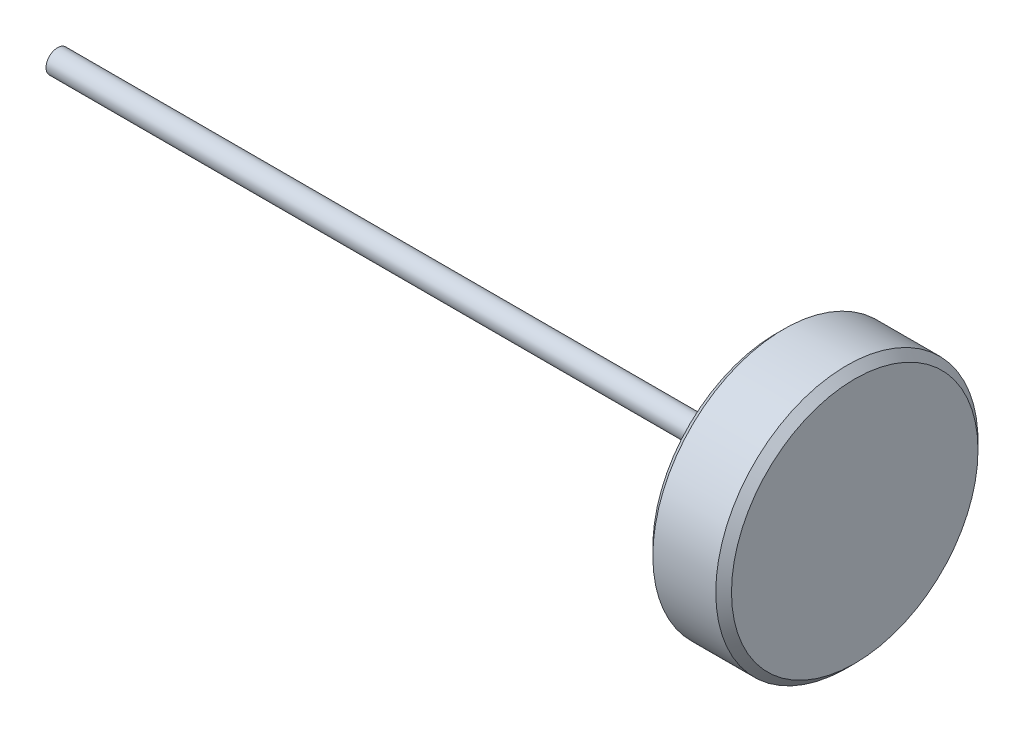
ISO-10303-21;
HEADER;
FILE_DESCRIPTION(('STEP AP214'),'2;1');
FILE_NAME('part.step','',(''),(''),'','','');
FILE_SCHEMA(('AUTOMOTIVE_DESIGN { 1 0 10303 214 1 1 1 1 }'));
ENDSEC;
DATA;
#1=APPLICATION_CONTEXT('core data for automotive mechanical design processes');
#2=APPLICATION_PROTOCOL_DEFINITION('international standard','automotive_design',2000,#1);
#3=PRODUCT_CONTEXT('',#1,'mechanical');
#4=PRODUCT('Part','Part','',(#3));
#5=PRODUCT_RELATED_PRODUCT_CATEGORY('part','',(#4));
#6=PRODUCT_DEFINITION_FORMATION('','',#4);
#7=PRODUCT_DEFINITION_CONTEXT('part definition',#1,'design');
#8=PRODUCT_DEFINITION('design','',#6,#7);
#9=PRODUCT_DEFINITION_SHAPE('','',#8);
#10=(LENGTH_UNIT() NAMED_UNIT(*) SI_UNIT(.MILLI.,.METRE.));
#11=(NAMED_UNIT(*) PLANE_ANGLE_UNIT() SI_UNIT($,.RADIAN.));
#12=(NAMED_UNIT(*) SI_UNIT($,.STERADIAN.) SOLID_ANGLE_UNIT());
#13=UNCERTAINTY_MEASURE_WITH_UNIT(LENGTH_MEASURE(1.E-05),#10,'distance_accuracy_value','');
#14=(GEOMETRIC_REPRESENTATION_CONTEXT(3) GLOBAL_UNCERTAINTY_ASSIGNED_CONTEXT((#13)) GLOBAL_UNIT_ASSIGNED_CONTEXT((#10,
#11,#12)) REPRESENTATION_CONTEXT('',''));
#15=CARTESIAN_POINT('',(0.,0.,0.));
#16=DIRECTION('',(0.,0.,1.));
#17=DIRECTION('',(1.,0.,0.));
#18=AXIS2_PLACEMENT_3D('',#15,#16,#17);
#19=CARTESIAN_POINT('',(19.05,0.,0.));
#20=DIRECTION('',(-1.,0.,0.));
#21=DIRECTION('',(0.,0.,1.));
#22=AXIS2_PLACEMENT_3D('',#19,#20,#21);
#23=CYLINDRICAL_SURFACE('',#22,31.75);
#24=CARTESIAN_POINT('',(17.1450000000001,0.,0.));
#25=DIRECTION('',(1.,0.,0.));
#26=DIRECTION('',(0.,0.,-1.));
#27=AXIS2_PLACEMENT_3D('',#24,#25,#26);
#28=CIRCLE('',#27,31.75);
#29=CARTESIAN_POINT('',(17.1450000000001,0.,31.75));
#30=VERTEX_POINT('',#29);
#31=EDGE_CURVE('E77',#30,#30,#28,.F.);
#32=CARTESIAN_POINT('',(1.90500000000014,0.,0.));
#33=DIRECTION('',(1.,0.,0.));
#34=DIRECTION('',(0.,0.,-1.));
#35=AXIS2_PLACEMENT_3D('',#32,#33,#34);
#36=CIRCLE('',#35,31.75);
#37=CARTESIAN_POINT('',(1.90500000000014,0.,31.75));
#38=VERTEX_POINT('',#37);
#39=EDGE_CURVE('E82',#38,#38,#36,.T.);
#40=CARTESIAN_POINT('',(17.1450000000001,0.,31.75));
#41=CARTESIAN_POINT('',(16.9862500000001,0.,31.75));
#42=CARTESIAN_POINT('',(16.8275000000001,0.,31.75));
#43=CARTESIAN_POINT('',(16.5100000000001,0.,31.75));
#44=CARTESIAN_POINT('',(16.3512500000001,0.,31.75));
#45=CARTESIAN_POINT('',(16.0337500000001,0.,31.75));
#46=CARTESIAN_POINT('',(15.8750000000001,0.,31.75));
#47=CARTESIAN_POINT('',(15.5575000000001,0.,31.75));
#48=CARTESIAN_POINT('',(15.3987500000001,0.,31.75));
#49=CARTESIAN_POINT('',(15.0812500000001,0.,31.75));
#50=CARTESIAN_POINT('',(14.9225000000001,0.,31.75));
#51=CARTESIAN_POINT('',(14.6050000000001,0.,31.75));
#52=CARTESIAN_POINT('',(14.4462500000001,0.,31.75));
#53=CARTESIAN_POINT('',(14.1287500000001,0.,31.75));
#54=CARTESIAN_POINT('',(13.9700000000001,0.,31.75));
#55=CARTESIAN_POINT('',(13.6525000000001,0.,31.75));
#56=CARTESIAN_POINT('',(13.4937500000001,0.,31.75));
#57=CARTESIAN_POINT('',(13.1762500000001,0.,31.75));
#58=CARTESIAN_POINT('',(13.0175000000001,0.,31.75));
#59=CARTESIAN_POINT('',(12.7000000000001,0.,31.75));
#60=CARTESIAN_POINT('',(12.5412500000001,0.,31.75));
#61=CARTESIAN_POINT('',(12.2237500000001,0.,31.75));
#62=CARTESIAN_POINT('',(12.0650000000001,0.,31.75));
#63=CARTESIAN_POINT('',(11.7475000000001,0.,31.75));
#64=CARTESIAN_POINT('',(11.5887500000001,0.,31.75));
#65=CARTESIAN_POINT('',(11.2712500000001,0.,31.75));
#66=CARTESIAN_POINT('',(11.1125000000001,0.,31.75));
#67=CARTESIAN_POINT('',(10.7950000000001,0.,31.75));
#68=CARTESIAN_POINT('',(10.6362500000001,0.,31.75));
#69=CARTESIAN_POINT('',(10.3187500000001,0.,31.75));
#70=CARTESIAN_POINT('',(10.1600000000001,0.,31.75));
#71=CARTESIAN_POINT('',(9.84250000000011,0.,31.75));
#72=CARTESIAN_POINT('',(9.68375000000011,0.,31.75));
#73=CARTESIAN_POINT('',(9.36625000000011,0.,31.75));
#74=CARTESIAN_POINT('',(9.20750000000011,0.,31.75));
#75=CARTESIAN_POINT('',(8.89000000000011,0.,31.75));
#76=CARTESIAN_POINT('',(8.73125000000011,0.,31.75));
#77=CARTESIAN_POINT('',(8.41375000000011,0.,31.75));
#78=CARTESIAN_POINT('',(8.25500000000011,0.,31.75));
#79=CARTESIAN_POINT('',(7.93750000000011,0.,31.75));
#80=CARTESIAN_POINT('',(7.77875000000011,0.,31.75));
#81=CARTESIAN_POINT('',(7.46125000000011,0.,31.75));
#82=CARTESIAN_POINT('',(7.30250000000012,0.,31.75));
#83=CARTESIAN_POINT('',(6.98500000000012,0.,31.75));
#84=CARTESIAN_POINT('',(6.82625000000012,0.,31.75));
#85=CARTESIAN_POINT('',(6.50875000000012,0.,31.75));
#86=CARTESIAN_POINT('',(6.35000000000012,0.,31.75));
#87=CARTESIAN_POINT('',(6.03250000000012,0.,31.75));
#88=CARTESIAN_POINT('',(5.87375000000012,0.,31.75));
#89=CARTESIAN_POINT('',(5.55625000000012,0.,31.75));
#90=CARTESIAN_POINT('',(5.39750000000012,0.,31.75));
#91=CARTESIAN_POINT('',(5.08000000000012,0.,31.75));
#92=CARTESIAN_POINT('',(4.92125000000012,0.,31.75));
#93=CARTESIAN_POINT('',(4.60375000000012,0.,31.75));
#94=CARTESIAN_POINT('',(4.44500000000012,0.,31.75));
#95=CARTESIAN_POINT('',(4.12750000000013,0.,31.75));
#96=CARTESIAN_POINT('',(3.96875000000013,0.,31.75));
#97=CARTESIAN_POINT('',(3.65125000000013,0.,31.75));
#98=CARTESIAN_POINT('',(3.49250000000013,0.,31.75));
#99=CARTESIAN_POINT('',(3.17500000000013,0.,31.75));
#100=CARTESIAN_POINT('',(3.01625000000013,0.,31.75));
#101=CARTESIAN_POINT('',(2.69875000000013,0.,31.75));
#102=CARTESIAN_POINT('',(2.54000000000013,0.,31.75));
#103=CARTESIAN_POINT('',(2.22250000000013,0.,31.75));
#104=CARTESIAN_POINT('',(2.06375000000013,0.,31.75));
#105=CARTESIAN_POINT('',(1.90500000000014,0.,31.75));
#106=B_SPLINE_CURVE_WITH_KNOTS('',3,(#40,#41,#42,#43,#44,#45,#46,#47,#48,#49,#50,#51,#52,#53,
#54,#55,#56,#57,#58,#59,#60,#61,#62,#63,#64,#65,#66,#67,#68,#69,#70,#71,#72,#73,#74,#75,#76,#77,
#78,#79,#80,#81,#82,#83,#84,#85,#86,#87,#88,#89,#90,#91,#92,#93,#94,#95,#96,#97,#98,#99,#100,
#101,#102,#103,#104,#105),.UNSPECIFIED.,.F.,.F.,(4,2,2,2,2,2,2,2,2,2,2,2,2,2,2,2,2,2,2,2,2,2,2,
2,2,2,2,2,2,2,2,2,4),(0.,0.476250000000001,0.952499999999998,1.42875,1.905,2.38124999999999,
2.85749999999999,3.33374999999999,3.80999999999999,4.28624999999998,4.76249999999998,
5.23874999999998,5.71499999999998,6.19124999999998,6.66749999999998,7.14374999999997,
7.61999999999997,8.09624999999997,8.57249999999997,9.04874999999997,9.52499999999997,10.00125,
10.4775,10.95375,11.43,11.90625,12.3825,12.85875,13.335,13.81125,14.2874999999999,
14.7637499999999,15.2399999999999),.UNSPECIFIED.);
#107=EDGE_CURVE('BSEAM68',#30,#38,#106,.T.);
#108=ORIENTED_EDGE('',*,*,#31,.T.);
#109=ORIENTED_EDGE('',*,*,#39,.T.);
#110=ORIENTED_EDGE('',*,*,#107,.T.);
#111=ORIENTED_EDGE('',*,*,#107,.F.);
#112=EDGE_LOOP('',(#108,#110,#109,#111));
#113=FACE_BOUND('',#112,.T.);
#114=ADVANCED_FACE('F68',(#113),#23,.T.);
#115=CARTESIAN_POINT('',(19.05,0.,0.));
#116=DIRECTION('',(1.,0.,0.));
#117=DIRECTION('',(0.,0.,-1.));
#118=AXIS2_PLACEMENT_3D('',#115,#116,#117);
#119=PLANE('',#118);
#120=CARTESIAN_POINT('',(19.05,0.,0.));
#121=DIRECTION('',(1.,0.,0.));
#122=DIRECTION('',(0.,0.,-1.));
#123=AXIS2_PLACEMENT_3D('',#120,#121,#122);
#124=CIRCLE('',#123,29.8450000000001);
#125=CARTESIAN_POINT('',(19.05,0.,-29.8450000000001));
#126=VERTEX_POINT('',#125);
#127=EDGE_CURVE('E87',#126,#126,#124,.T.);
#128=ORIENTED_EDGE('',*,*,#127,.T.);
#129=EDGE_LOOP('',(#128));
#130=FACE_BOUND('',#129,.T.);
#131=ADVANCED_FACE('F120',(#130),#119,.T.);
#132=CARTESIAN_POINT('',(0.,0.,0.));
#133=DIRECTION('',(1.,0.,0.));
#134=DIRECTION('',(0.,0.,-1.));
#135=AXIS2_PLACEMENT_3D('',#132,#133,#134);
#136=PLANE('',#135);
#137=CARTESIAN_POINT('',(0.,0.,0.));
#138=DIRECTION('',(1.,0.,0.));
#139=DIRECTION('',(0.,0.,-1.));
#140=AXIS2_PLACEMENT_3D('',#137,#138,#139);
#141=CIRCLE('',#140,29.8449999999999);
#142=CARTESIAN_POINT('',(0.,0.,-29.8449999999999));
#143=VERTEX_POINT('',#142);
#144=EDGE_CURVE('E11',#143,#143,#141,.F.);
#145=ORIENTED_EDGE('',*,*,#144,.T.);
#146=EDGE_LOOP('',(#145));
#147=FACE_BOUND('',#146,.T.);
#148=CARTESIAN_POINT('',(0.,0.,0.));
#149=DIRECTION('',(1.,0.,0.));
#150=DIRECTION('',(0.,0.,-1.));
#151=AXIS2_PLACEMENT_3D('',#148,#149,#150);
#152=CIRCLE('',#151,7.239);
#153=CARTESIAN_POINT('',(0.,0.,-7.239));
#154=VERTEX_POINT('',#153);
#155=EDGE_CURVE('E93',#154,#154,#152,.T.);
#156=ORIENTED_EDGE('',*,*,#155,.T.);
#157=EDGE_LOOP('',(#156));
#158=FACE_BOUND('',#157,.T.);
#159=ADVANCED_FACE('F110',(#147,#158),#136,.F.);
#160=CARTESIAN_POINT('',(-173.99,0.,0.));
#161=DIRECTION('',(1.,0.,0.));
#162=DIRECTION('',(0.,0.,-1.));
#163=AXIS2_PLACEMENT_3D('',#160,#161,#162);
#164=CYLINDRICAL_SURFACE('',#163,2.794);
#165=CARTESIAN_POINT('',(-4.445,0.,0.));
#166=DIRECTION('',(1.,0.,0.));
#167=DIRECTION('',(0.,0.,-1.));
#168=AXIS2_PLACEMENT_3D('',#165,#166,#167);
#169=CIRCLE('',#168,2.794);
#170=CARTESIAN_POINT('',(-4.445,0.,-2.794));
#171=VERTEX_POINT('',#170);
#172=EDGE_CURVE('E97',#171,#171,#169,.F.);
#173=ORIENTED_EDGE('',*,*,#172,.T.);
#174=EDGE_LOOP('',(#173));
#175=FACE_BOUND('',#174,.T.);
#176=CARTESIAN_POINT('',(-173.99,0.,0.));
#177=DIRECTION('',(-1.,0.,0.));
#178=DIRECTION('',(0.,0.,1.));
#179=AXIS2_PLACEMENT_3D('',#176,#177,#178);
#180=CIRCLE('',#179,2.794);
#181=CARTESIAN_POINT('',(-173.99,0.,2.794));
#182=VERTEX_POINT('',#181);
#183=EDGE_CURVE('E101',#182,#182,#180,.T.);
#184=ORIENTED_EDGE('',*,*,#183,.F.);
#185=EDGE_LOOP('',(#184));
#186=FACE_BOUND('',#185,.T.);
#187=ADVANCED_FACE('F108',(#175,#186),#164,.T.);
#188=CARTESIAN_POINT('',(-173.99,0.,0.));
#189=DIRECTION('',(-1.,0.,0.));
#190=DIRECTION('',(0.,0.,1.));
#191=AXIS2_PLACEMENT_3D('',#188,#189,#190);
#192=PLANE('',#191);
#193=ORIENTED_EDGE('',*,*,#183,.T.);
#194=EDGE_LOOP('',(#193));
#195=FACE_BOUND('',#194,.T.);
#196=ADVANCED_FACE('F106',(#195),#192,.T.);
#197=CARTESIAN_POINT('',(-4.445,0.,0.));
#198=DIRECTION('',(1.,0.,0.));
#199=DIRECTION('',(0.,0.,-1.));
#200=AXIS2_PLACEMENT_3D('',#197,#198,#199);
#201=TOROIDAL_SURFACE('',#200,7.239,4.445);
#202=ORIENTED_EDGE('',*,*,#155,.F.);
#203=EDGE_LOOP('',(#202));
#204=FACE_BOUND('',#203,.T.);
#205=ORIENTED_EDGE('',*,*,#172,.F.);
#206=EDGE_LOOP('',(#205));
#207=FACE_BOUND('',#206,.T.);
#208=ADVANCED_FACE('F117',(#204,#207),#201,.F.);
#209=CARTESIAN_POINT('',(19.05,0.,0.));
#210=DIRECTION('',(-1.,0.,0.));
#211=DIRECTION('',(0.,0.,1.));
#212=AXIS2_PLACEMENT_3D('',#209,#210,#211);
#213=CONICAL_SURFACE('',#212,29.8450000000001,0.785398163397446);
#214=ORIENTED_EDGE('',*,*,#31,.F.);
#215=EDGE_LOOP('',(#214));
#216=FACE_BOUND('',#215,.T.);
#217=ORIENTED_EDGE('',*,*,#127,.F.);
#218=EDGE_LOOP('',(#217));
#219=FACE_BOUND('',#218,.T.);
#220=ADVANCED_FACE('F131',(#216,#219),#213,.T.);
#221=CARTESIAN_POINT('',(1.90500000000014,0.,0.));
#222=DIRECTION('',(1.,0.,0.));
#223=DIRECTION('',(0.,0.,-1.));
#224=AXIS2_PLACEMENT_3D('',#221,#222,#223);
#225=CONICAL_SURFACE('',#224,31.75,0.785398163397447);
#226=ORIENTED_EDGE('',*,*,#144,.F.);
#227=EDGE_LOOP('',(#226));
#228=FACE_BOUND('',#227,.T.);
#229=ORIENTED_EDGE('',*,*,#39,.F.);
#230=EDGE_LOOP('',(#229));
#231=FACE_BOUND('',#230,.T.);
#232=ADVANCED_FACE('F71',(#228,#231),#225,.T.);
#233=CLOSED_SHELL('',(#114,#131,#159,#187,#196,#208,#220,#232));
#234=MANIFOLD_SOLID_BREP('B2',#233);
#235=ADVANCED_BREP_SHAPE_REPRESENTATION('',(#18,#234),#14);
#236=SHAPE_DEFINITION_REPRESENTATION(#9,#235);
ENDSEC;
END-ISO-10303-21;
